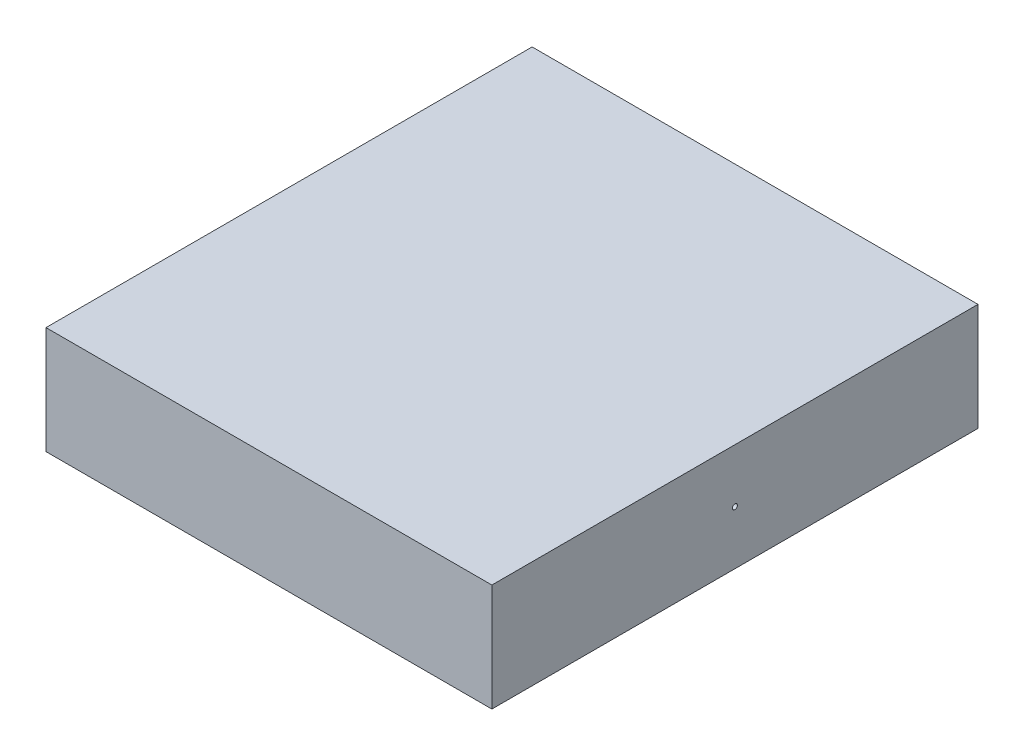
ISO-10303-21;
HEADER;
FILE_DESCRIPTION(('STEP AP214'),'2;1');
FILE_NAME('part.step','',(''),(''),'','','');
FILE_SCHEMA(('AUTOMOTIVE_DESIGN { 1 0 10303 214 1 1 1 1 }'));
ENDSEC;
DATA;
#1=APPLICATION_CONTEXT('core data for automotive mechanical design processes');
#2=APPLICATION_PROTOCOL_DEFINITION('international standard','automotive_design',2000,#1);
#3=PRODUCT_CONTEXT('',#1,'mechanical');
#4=PRODUCT('Part','Part','',(#3));
#5=PRODUCT_RELATED_PRODUCT_CATEGORY('part','',(#4));
#6=PRODUCT_DEFINITION_FORMATION('','',#4);
#7=PRODUCT_DEFINITION_CONTEXT('part definition',#1,'design');
#8=PRODUCT_DEFINITION('design','',#6,#7);
#9=PRODUCT_DEFINITION_SHAPE('','',#8);
#10=(LENGTH_UNIT() NAMED_UNIT(*) SI_UNIT(.MILLI.,.METRE.));
#11=(NAMED_UNIT(*) PLANE_ANGLE_UNIT() SI_UNIT($,.RADIAN.));
#12=(NAMED_UNIT(*) SI_UNIT($,.STERADIAN.) SOLID_ANGLE_UNIT());
#13=UNCERTAINTY_MEASURE_WITH_UNIT(LENGTH_MEASURE(1.E-05),#10,'distance_accuracy_value','');
#14=(GEOMETRIC_REPRESENTATION_CONTEXT(3) GLOBAL_UNCERTAINTY_ASSIGNED_CONTEXT((#13)) GLOBAL_UNIT_ASSIGNED_CONTEXT((#10,
#11,#12)) REPRESENTATION_CONTEXT('',''));
#15=CARTESIAN_POINT('',(0.,0.,0.));
#16=DIRECTION('',(0.,0.,1.));
#17=DIRECTION('',(1.,0.,0.));
#18=AXIS2_PLACEMENT_3D('',#15,#16,#17);
#19=CARTESIAN_POINT('',(17.0561,1.0414,-9.3472));
#20=DIRECTION('',(-1.,0.,0.));
#21=DIRECTION('',(0.,0.,1.));
#22=AXIS2_PLACEMENT_3D('',#19,#20,#21);
#23=PLANE('',#22);
#24=CARTESIAN_POINT('',(17.0561,-9.92505,-58.9661));
#25=DIRECTION('',(-1.,0.,0.));
#26=DIRECTION('',(0.,0.,1.));
#27=AXIS2_PLACEMENT_3D('',#24,#25,#26);
#28=CIRCLE('',#27,0.508000000000002);
#29=CARTESIAN_POINT('',(17.0561,-9.92505,-58.4581));
#30=VERTEX_POINT('',#29);
#31=EDGE_CURVE('E124',#30,#30,#28,.F.);
#32=ORIENTED_EDGE('',*,*,#31,.T.);
#33=EDGE_LOOP('',(#32));
#34=FACE_BOUND('',#33,.T.);
#35=DIRECTION('',(0.,0.,-1.));
#36=VECTOR('',#35,1.);
#37=CARTESIAN_POINT('',(17.0561,-20.8915,-9.3472));
#38=LINE('',#37,#36);
#39=CARTESIAN_POINT('',(17.0561,-20.8915,-9.3472));
#40=VERTEX_POINT('',#39);
#41=CARTESIAN_POINT('',(17.0561,-20.8915,-108.585));
#42=VERTEX_POINT('',#41);
#43=EDGE_CURVE('E119',#40,#42,#38,.T.);
#44=ORIENTED_EDGE('',*,*,#43,.F.);
#45=DIRECTION('',(0.,-1.,0.));
#46=VECTOR('',#45,1.);
#47=CARTESIAN_POINT('',(17.0561,1.0414,-9.3472));
#48=LINE('',#47,#46);
#49=CARTESIAN_POINT('',(17.0561,1.0414,-9.3472));
#50=VERTEX_POINT('',#49);
#51=EDGE_CURVE('E11',#50,#40,#48,.T.);
#52=ORIENTED_EDGE('',*,*,#51,.F.);
#53=DIRECTION('',(0.,0.,-1.));
#54=VECTOR('',#53,1.);
#55=CARTESIAN_POINT('',(17.0561,1.0414,-9.3472));
#56=LINE('',#55,#54);
#57=CARTESIAN_POINT('',(17.0561,1.0414,-108.585));
#58=VERTEX_POINT('',#57);
#59=EDGE_CURVE('E111',#50,#58,#56,.T.);
#60=ORIENTED_EDGE('',*,*,#59,.T.);
#61=DIRECTION('',(0.,-1.,0.));
#62=VECTOR('',#61,1.);
#63=CARTESIAN_POINT('',(17.0561,1.0414,-108.585));
#64=LINE('',#63,#62);
#65=EDGE_CURVE('E87',#58,#42,#64,.T.);
#66=ORIENTED_EDGE('',*,*,#65,.T.);
#67=EDGE_LOOP('',(#44,#52,#60,#66));
#68=FACE_BOUND('',#67,.T.);
#69=ADVANCED_FACE('F45',(#34,#68),#23,.T.);
#70=CARTESIAN_POINT('',(17.0561,1.0414,-9.3472));
#71=DIRECTION('',(0.,0.,-1.));
#72=DIRECTION('',(-1.,0.,0.));
#73=AXIS2_PLACEMENT_3D('',#70,#71,#72);
#74=PLANE('',#73);
#75=DIRECTION('',(1.,0.,0.));
#76=VECTOR('',#75,1.);
#77=CARTESIAN_POINT('',(17.0561,-20.8915,-9.3472));
#78=LINE('',#77,#76);
#79=CARTESIAN_POINT('',(108.077,-20.8915,-9.3472));
#80=VERTEX_POINT('',#79);
#81=EDGE_CURVE('E79',#40,#80,#78,.T.);
#82=ORIENTED_EDGE('',*,*,#81,.T.);
#83=DIRECTION('',(0.,-1.,0.));
#84=VECTOR('',#83,1.);
#85=CARTESIAN_POINT('',(108.077,1.0414,-9.3472));
#86=LINE('',#85,#84);
#87=CARTESIAN_POINT('',(108.077,1.0414,-9.3472));
#88=VERTEX_POINT('',#87);
#89=EDGE_CURVE('E55',#88,#80,#86,.T.);
#90=ORIENTED_EDGE('',*,*,#89,.F.);
#91=DIRECTION('',(1.,0.,0.));
#92=VECTOR('',#91,1.);
#93=CARTESIAN_POINT('',(17.0561,1.0414,-9.3472));
#94=LINE('',#93,#92);
#95=EDGE_CURVE('E97',#50,#88,#94,.T.);
#96=ORIENTED_EDGE('',*,*,#95,.F.);
#97=ORIENTED_EDGE('',*,*,#51,.T.);
#98=EDGE_LOOP('',(#82,#90,#96,#97));
#99=FACE_BOUND('',#98,.T.);
#100=ADVANCED_FACE('F161',(#99),#74,.F.);
#101=CARTESIAN_POINT('',(108.077,1.0414,-9.3472));
#102=DIRECTION('',(-1.,0.,0.));
#103=DIRECTION('',(0.,0.,1.));
#104=AXIS2_PLACEMENT_3D('',#101,#102,#103);
#105=PLANE('',#104);
#106=CARTESIAN_POINT('',(108.077,-9.92505,-58.9661));
#107=DIRECTION('',(-1.,0.,0.));
#108=DIRECTION('',(0.,0.,1.));
#109=AXIS2_PLACEMENT_3D('',#106,#107,#108);
#110=CIRCLE('',#109,0.508000000000002);
#111=CARTESIAN_POINT('',(108.077,-9.92505,-58.4581));
#112=VERTEX_POINT('',#111);
#113=EDGE_CURVE('E48',#112,#112,#110,.F.);
#114=ORIENTED_EDGE('',*,*,#113,.F.);
#115=EDGE_LOOP('',(#114));
#116=FACE_BOUND('',#115,.T.);
#117=DIRECTION('',(0.,0.,-1.));
#118=VECTOR('',#117,1.);
#119=CARTESIAN_POINT('',(108.077,-20.8915,-9.3472));
#120=LINE('',#119,#118);
#121=CARTESIAN_POINT('',(108.077,-20.8915,-108.585));
#122=VERTEX_POINT('',#121);
#123=EDGE_CURVE('E105',#80,#122,#120,.T.);
#124=ORIENTED_EDGE('',*,*,#123,.T.);
#125=DIRECTION('',(0.,-1.,0.));
#126=VECTOR('',#125,1.);
#127=CARTESIAN_POINT('',(108.077,1.0414,-108.585));
#128=LINE('',#127,#126);
#129=CARTESIAN_POINT('',(108.077,1.0414,-108.585));
#130=VERTEX_POINT('',#129);
#131=EDGE_CURVE('E102',#130,#122,#128,.T.);
#132=ORIENTED_EDGE('',*,*,#131,.F.);
#133=DIRECTION('',(0.,0.,-1.));
#134=VECTOR('',#133,1.);
#135=CARTESIAN_POINT('',(108.077,1.0414,-9.3472));
#136=LINE('',#135,#134);
#137=EDGE_CURVE('E92',#88,#130,#136,.T.);
#138=ORIENTED_EDGE('',*,*,#137,.F.);
#139=ORIENTED_EDGE('',*,*,#89,.T.);
#140=EDGE_LOOP('',(#124,#132,#138,#139));
#141=FACE_BOUND('',#140,.T.);
#142=ADVANCED_FACE('F103',(#116,#141),#105,.F.);
#143=CARTESIAN_POINT('',(17.0561,1.0414,-108.585));
#144=DIRECTION('',(0.,0.,-1.));
#145=DIRECTION('',(-1.,0.,0.));
#146=AXIS2_PLACEMENT_3D('',#143,#144,#145);
#147=PLANE('',#146);
#148=DIRECTION('',(1.,0.,0.));
#149=VECTOR('',#148,1.);
#150=CARTESIAN_POINT('',(17.0561,-20.8915,-108.585));
#151=LINE('',#150,#149);
#152=EDGE_CURVE('E123',#42,#122,#151,.T.);
#153=ORIENTED_EDGE('',*,*,#152,.F.);
#154=ORIENTED_EDGE('',*,*,#65,.F.);
#155=DIRECTION('',(1.,0.,0.));
#156=VECTOR('',#155,1.);
#157=CARTESIAN_POINT('',(17.0561,1.0414,-108.585));
#158=LINE('',#157,#156);
#159=EDGE_CURVE('E96',#58,#130,#158,.T.);
#160=ORIENTED_EDGE('',*,*,#159,.T.);
#161=ORIENTED_EDGE('',*,*,#131,.T.);
#162=EDGE_LOOP('',(#153,#154,#160,#161));
#163=FACE_BOUND('',#162,.T.);
#164=ADVANCED_FACE('F109',(#163),#147,.T.);
#165=CARTESIAN_POINT('',(0.,1.0414,0.));
#166=DIRECTION('',(0.,-1.,0.));
#167=DIRECTION('',(0.,0.,-1.));
#168=AXIS2_PLACEMENT_3D('',#165,#166,#167);
#169=PLANE('',#168);
#170=ORIENTED_EDGE('',*,*,#59,.F.);
#171=ORIENTED_EDGE('',*,*,#95,.T.);
#172=ORIENTED_EDGE('',*,*,#137,.T.);
#173=ORIENTED_EDGE('',*,*,#159,.F.);
#174=EDGE_LOOP('',(#170,#171,#172,#173));
#175=FACE_BOUND('',#174,.T.);
#176=ADVANCED_FACE('F95',(#175),#169,.F.);
#177=CARTESIAN_POINT('',(0.,-20.8915,0.));
#178=DIRECTION('',(0.,-1.,0.));
#179=DIRECTION('',(0.,0.,-1.));
#180=AXIS2_PLACEMENT_3D('',#177,#178,#179);
#181=PLANE('',#180);
#182=ORIENTED_EDGE('',*,*,#43,.T.);
#183=ORIENTED_EDGE('',*,*,#152,.T.);
#184=ORIENTED_EDGE('',*,*,#123,.F.);
#185=ORIENTED_EDGE('',*,*,#81,.F.);
#186=EDGE_LOOP('',(#182,#183,#184,#185));
#187=FACE_BOUND('',#186,.T.);
#188=ADVANCED_FACE('F174',(#187),#181,.T.);
#189=CARTESIAN_POINT('',(14.5161,-9.92505,-58.9661));
#190=DIRECTION('',(1.,0.,0.));
#191=DIRECTION('',(0.,0.,-1.));
#192=AXIS2_PLACEMENT_3D('',#189,#190,#191);
#193=CYLINDRICAL_SURFACE('',#192,0.508000000000002);
#194=ORIENTED_EDGE('',*,*,#31,.F.);
#195=EDGE_LOOP('',(#194));
#196=FACE_BOUND('',#195,.T.);
#197=CARTESIAN_POINT('',(19.5961,-9.92505,-58.9661));
#198=DIRECTION('',(-1.,0.,0.));
#199=DIRECTION('',(0.,0.,1.));
#200=AXIS2_PLACEMENT_3D('',#197,#198,#199);
#201=CIRCLE('',#200,0.508000000000002);
#202=CARTESIAN_POINT('',(19.5961,-9.92505,-58.4581));
#203=VERTEX_POINT('',#202);
#204=EDGE_CURVE('E136',#203,#203,#201,.T.);
#205=ORIENTED_EDGE('',*,*,#204,.F.);
#206=EDGE_LOOP('',(#205));
#207=FACE_BOUND('',#206,.T.);
#208=ADVANCED_FACE('F176',(#196,#207),#193,.F.);
#209=CARTESIAN_POINT('',(19.5961,-9.92505,-58.9661));
#210=DIRECTION('',(-1.,0.,0.));
#211=DIRECTION('',(0.,0.,1.));
#212=AXIS2_PLACEMENT_3D('',#209,#210,#211);
#213=PLANE('',#212);
#214=ORIENTED_EDGE('',*,*,#204,.T.);
#215=EDGE_LOOP('',(#214));
#216=FACE_BOUND('',#215,.T.);
#217=ADVANCED_FACE('F156',(#216),#213,.T.);
#218=CARTESIAN_POINT('',(110.617,-9.92505,-58.9661));
#219=DIRECTION('',(-1.,0.,0.));
#220=DIRECTION('',(0.,0.,1.));
#221=AXIS2_PLACEMENT_3D('',#218,#219,#220);
#222=CYLINDRICAL_SURFACE('',#221,0.508000000000002);
#223=CARTESIAN_POINT('',(105.537,-9.92505,-58.9661));
#224=DIRECTION('',(1.,0.,0.));
#225=DIRECTION('',(0.,0.,-1.));
#226=AXIS2_PLACEMENT_3D('',#223,#224,#225);
#227=CIRCLE('',#226,0.508000000000002);
#228=CARTESIAN_POINT('',(105.537,-9.92505,-59.4741));
#229=VERTEX_POINT('',#228);
#230=EDGE_CURVE('E145',#229,#229,#227,.T.);
#231=ORIENTED_EDGE('',*,*,#230,.F.);
#232=EDGE_LOOP('',(#231));
#233=FACE_BOUND('',#232,.T.);
#234=ORIENTED_EDGE('',*,*,#113,.T.);
#235=EDGE_LOOP('',(#234));
#236=FACE_BOUND('',#235,.T.);
#237=ADVANCED_FACE('F153',(#233,#236),#222,.F.);
#238=CARTESIAN_POINT('',(105.537,-9.92505,-58.9661));
#239=DIRECTION('',(1.,0.,0.));
#240=DIRECTION('',(0.,0.,-1.));
#241=AXIS2_PLACEMENT_3D('',#238,#239,#240);
#242=PLANE('',#241);
#243=ORIENTED_EDGE('',*,*,#230,.T.);
#244=EDGE_LOOP('',(#243));
#245=FACE_BOUND('',#244,.T.);
#246=ADVANCED_FACE('F151',(#245),#242,.T.);
#247=CLOSED_SHELL('',(#69,#100,#142,#164,#176,#188,#208,#217,#237,#246));
#248=MANIFOLD_SOLID_BREP('B2',#247);
#249=ADVANCED_BREP_SHAPE_REPRESENTATION('',(#18,#248),#14);
#250=SHAPE_DEFINITION_REPRESENTATION(#9,#249);
ENDSEC;
END-ISO-10303-21;
